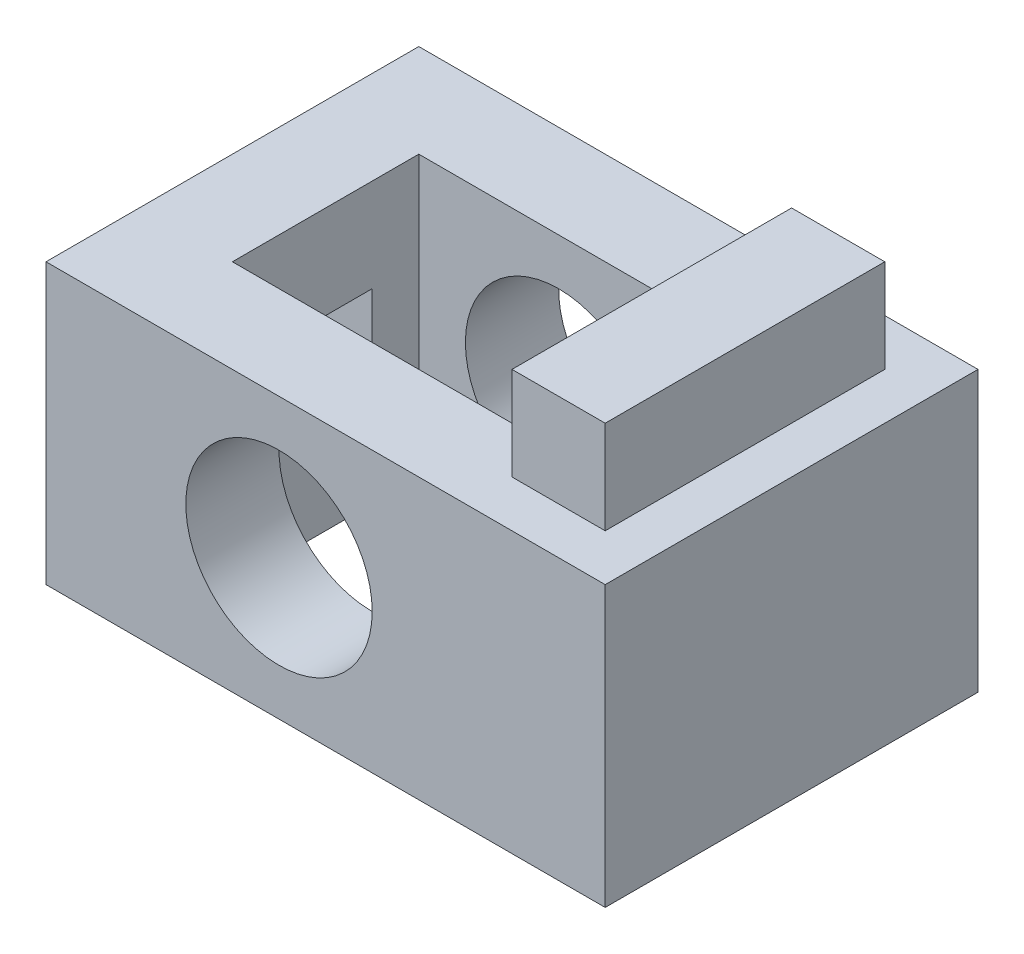
ISO-10303-21;
HEADER;
FILE_DESCRIPTION(('STEP AP214'),'2;1');
FILE_NAME('part.step','',(''),(''),'','','');
FILE_SCHEMA(('AUTOMOTIVE_DESIGN { 1 0 10303 214 1 1 1 1 }'));
ENDSEC;
DATA;
#1=APPLICATION_CONTEXT('core data for automotive mechanical design processes');
#2=APPLICATION_PROTOCOL_DEFINITION('international standard','automotive_design',2000,#1);
#3=PRODUCT_CONTEXT('',#1,'mechanical');
#4=PRODUCT('Part','Part','',(#3));
#5=PRODUCT_RELATED_PRODUCT_CATEGORY('part','',(#4));
#6=PRODUCT_DEFINITION_FORMATION('','',#4);
#7=PRODUCT_DEFINITION_CONTEXT('part definition',#1,'design');
#8=PRODUCT_DEFINITION('design','',#6,#7);
#9=PRODUCT_DEFINITION_SHAPE('','',#8);
#10=(LENGTH_UNIT() NAMED_UNIT(*) SI_UNIT(.MILLI.,.METRE.));
#11=(NAMED_UNIT(*) PLANE_ANGLE_UNIT() SI_UNIT($,.RADIAN.));
#12=(NAMED_UNIT(*) SI_UNIT($,.STERADIAN.) SOLID_ANGLE_UNIT());
#13=UNCERTAINTY_MEASURE_WITH_UNIT(LENGTH_MEASURE(1.E-05),#10,'distance_accuracy_value','');
#14=(GEOMETRIC_REPRESENTATION_CONTEXT(3) GLOBAL_UNCERTAINTY_ASSIGNED_CONTEXT((#13)) GLOBAL_UNIT_ASSIGNED_CONTEXT((#10,
#11,#12)) REPRESENTATION_CONTEXT('',''));
#15=CARTESIAN_POINT('',(0.,0.,0.));
#16=DIRECTION('',(0.,0.,1.));
#17=DIRECTION('',(1.,0.,0.));
#18=AXIS2_PLACEMENT_3D('',#15,#16,#17);
#19=CARTESIAN_POINT('',(-25.4,0.,-127.));
#20=DIRECTION('',(0.,0.,1.));
#21=DIRECTION('',(1.,0.,0.));
#22=AXIS2_PLACEMENT_3D('',#19,#20,#21);
#23=CYLINDRICAL_SURFACE('',#22,50.8);
#24=CARTESIAN_POINT('',(-25.4,0.,-50.8));
#25=DIRECTION('',(0.,0.,-1.));
#26=DIRECTION('',(-1.,0.,0.));
#27=AXIS2_PLACEMENT_3D('',#24,#25,#26);
#28=CIRCLE('',#27,50.8);
#29=CARTESIAN_POINT('',(-76.2,0.,-50.8));
#30=VERTEX_POINT('',#29);
#31=EDGE_CURVE('E192',#30,#30,#28,.F.);
#32=ORIENTED_EDGE('',*,*,#31,.T.);
#33=EDGE_LOOP('',(#32));
#34=FACE_BOUND('',#33,.T.);
#35=CARTESIAN_POINT('',(-25.4,0.,-101.6));
#36=DIRECTION('',(0.,0.,1.));
#37=DIRECTION('',(0.,-1.,0.));
#38=AXIS2_PLACEMENT_3D('',#35,#36,#37);
#39=CIRCLE('',#38,50.8);
#40=CARTESIAN_POINT('',(-25.4,-50.8,-101.6));
#41=VERTEX_POINT('',#40);
#42=EDGE_CURVE('E260',#41,#41,#39,.T.);
#43=ORIENTED_EDGE('',*,*,#42,.F.);
#44=EDGE_LOOP('',(#43));
#45=FACE_BOUND('',#44,.T.);
#46=ADVANCED_FACE('F47',(#34,#45),#23,.F.);
#47=CARTESIAN_POINT('',(152.4,76.2,101.6));
#48=DIRECTION('',(0.,-1.,0.));
#49=DIRECTION('',(0.,0.,-1.));
#50=AXIS2_PLACEMENT_3D('',#47,#48,#49);
#51=PLANE('',#50);
#52=DIRECTION('',(1.,0.,0.));
#53=VECTOR('',#52,1.);
#54=CARTESIAN_POINT('',(-101.6,76.2,50.8));
#55=LINE('',#54,#53);
#56=CARTESIAN_POINT('',(-101.6,76.2,50.8));
#57=VERTEX_POINT('',#56);
#58=CARTESIAN_POINT('',(50.8,76.2,50.8));
#59=VERTEX_POINT('',#58);
#60=EDGE_CURVE('E170',#57,#59,#55,.T.);
#61=ORIENTED_EDGE('',*,*,#60,.F.);
#62=DIRECTION('',(0.,0.,1.));
#63=VECTOR('',#62,1.);
#64=CARTESIAN_POINT('',(-101.6,76.2,-50.8));
#65=LINE('',#64,#63);
#66=CARTESIAN_POINT('',(-101.6,76.2,-50.8));
#67=VERTEX_POINT('',#66);
#68=EDGE_CURVE('E62',#67,#57,#65,.T.);
#69=ORIENTED_EDGE('',*,*,#68,.F.);
#70=DIRECTION('',(-1.,0.,0.));
#71=VECTOR('',#70,1.);
#72=CARTESIAN_POINT('',(-101.6,76.2,-50.8));
#73=LINE('',#72,#71);
#74=CARTESIAN_POINT('',(50.8,76.2,-50.8));
#75=VERTEX_POINT('',#74);
#76=EDGE_CURVE('E177',#75,#67,#73,.T.);
#77=ORIENTED_EDGE('',*,*,#76,.F.);
#78=DIRECTION('',(0.,0.,-1.));
#79=VECTOR('',#78,1.);
#80=CARTESIAN_POINT('',(50.8,76.2,-50.8));
#81=LINE('',#80,#79);
#82=EDGE_CURVE('E163',#59,#75,#81,.T.);
#83=ORIENTED_EDGE('',*,*,#82,.F.);
#84=EDGE_LOOP('',(#61,#69,#77,#83));
#85=FACE_BOUND('',#84,.T.);
#86=DIRECTION('',(0.,0.,1.));
#87=VECTOR('',#86,1.);
#88=CARTESIAN_POINT('',(-152.4,76.2,101.6));
#89=LINE('',#88,#87);
#90=CARTESIAN_POINT('',(-152.4,76.2,-101.6));
#91=VERTEX_POINT('',#90);
#92=CARTESIAN_POINT('',(-152.4,76.2,101.6));
#93=VERTEX_POINT('',#92);
#94=EDGE_CURVE('E265',#91,#93,#89,.T.);
#95=ORIENTED_EDGE('',*,*,#94,.T.);
#96=DIRECTION('',(-1.,0.,0.));
#97=VECTOR('',#96,1.);
#98=CARTESIAN_POINT('',(152.4,76.2,101.6));
#99=LINE('',#98,#97);
#100=CARTESIAN_POINT('',(152.4,76.2,101.6));
#101=VERTEX_POINT('',#100);
#102=EDGE_CURVE('E271',#101,#93,#99,.T.);
#103=ORIENTED_EDGE('',*,*,#102,.F.);
#104=DIRECTION('',(0.,0.,1.));
#105=VECTOR('',#104,1.);
#106=CARTESIAN_POINT('',(152.4,76.2,101.6));
#107=LINE('',#106,#105);
#108=CARTESIAN_POINT('',(152.4,76.2,-101.6));
#109=VERTEX_POINT('',#108);
#110=EDGE_CURVE('E269',#109,#101,#107,.T.);
#111=ORIENTED_EDGE('',*,*,#110,.F.);
#112=DIRECTION('',(-1.,0.,0.));
#113=VECTOR('',#112,1.);
#114=CARTESIAN_POINT('',(152.4,76.2,-101.6));
#115=LINE('',#114,#113);
#116=EDGE_CURVE('E282',#109,#91,#115,.T.);
#117=ORIENTED_EDGE('',*,*,#116,.T.);
#118=EDGE_LOOP('',(#95,#103,#111,#117));
#119=FACE_BOUND('',#118,.T.);
#120=DIRECTION('',(0.,0.,1.));
#121=VECTOR('',#120,1.);
#122=CARTESIAN_POINT('',(76.2,76.2,-76.2));
#123=LINE('',#122,#121);
#124=CARTESIAN_POINT('',(76.2,76.2,-76.2));
#125=VERTEX_POINT('',#124);
#126=CARTESIAN_POINT('',(76.2,76.2,76.2));
#127=VERTEX_POINT('',#126);
#128=EDGE_CURVE('E196',#125,#127,#123,.T.);
#129=ORIENTED_EDGE('',*,*,#128,.F.);
#130=DIRECTION('',(-1.,0.,0.));
#131=VECTOR('',#130,1.);
#132=CARTESIAN_POINT('',(76.2,76.2,-76.2));
#133=LINE('',#132,#131);
#134=CARTESIAN_POINT('',(127.,76.2,-76.2));
#135=VERTEX_POINT('',#134);
#136=EDGE_CURVE('E201',#135,#125,#133,.T.);
#137=ORIENTED_EDGE('',*,*,#136,.F.);
#138=DIRECTION('',(0.,0.,-1.));
#139=VECTOR('',#138,1.);
#140=CARTESIAN_POINT('',(127.,76.2,-76.2));
#141=LINE('',#140,#139);
#142=CARTESIAN_POINT('',(127.,76.2,76.2));
#143=VERTEX_POINT('',#142);
#144=EDGE_CURVE('E213',#143,#135,#141,.T.);
#145=ORIENTED_EDGE('',*,*,#144,.F.);
#146=DIRECTION('',(1.,0.,0.));
#147=VECTOR('',#146,1.);
#148=CARTESIAN_POINT('',(76.2,76.2,76.2));
#149=LINE('',#148,#147);
#150=EDGE_CURVE('E210',#127,#143,#149,.T.);
#151=ORIENTED_EDGE('',*,*,#150,.F.);
#152=EDGE_LOOP('',(#129,#137,#145,#151));
#153=FACE_BOUND('',#152,.T.);
#154=ADVANCED_FACE('F174',(#85,#119,#153),#51,.F.);
#155=CARTESIAN_POINT('',(152.4,76.2,101.6));
#156=DIRECTION('',(0.,0.,-1.));
#157=DIRECTION('',(0.,1.,0.));
#158=AXIS2_PLACEMENT_3D('',#155,#156,#157);
#159=PLANE('',#158);
#160=CARTESIAN_POINT('',(-25.4,0.,101.6));
#161=DIRECTION('',(0.,0.,1.));
#162=DIRECTION('',(1.,0.,0.));
#163=AXIS2_PLACEMENT_3D('',#160,#161,#162);
#164=CIRCLE('',#163,50.8);
#165=CARTESIAN_POINT('',(25.4,0.,101.6));
#166=VERTEX_POINT('',#165);
#167=EDGE_CURVE('E251',#166,#166,#164,.T.);
#168=ORIENTED_EDGE('',*,*,#167,.F.);
#169=EDGE_LOOP('',(#168));
#170=FACE_BOUND('',#169,.T.);
#171=DIRECTION('',(0.,-1.,0.));
#172=VECTOR('',#171,1.);
#173=CARTESIAN_POINT('',(-152.4,76.2,101.6));
#174=LINE('',#173,#172);
#175=CARTESIAN_POINT('',(-152.4,-76.2,101.6));
#176=VERTEX_POINT('',#175);
#177=EDGE_CURVE('E272',#93,#176,#174,.T.);
#178=ORIENTED_EDGE('',*,*,#177,.T.);
#179=DIRECTION('',(-1.,0.,0.));
#180=VECTOR('',#179,1.);
#181=CARTESIAN_POINT('',(152.4,-76.2,101.6));
#182=LINE('',#181,#180);
#183=CARTESIAN_POINT('',(152.4,-76.2,101.6));
#184=VERTEX_POINT('',#183);
#185=EDGE_CURVE('E55',#184,#176,#182,.T.);
#186=ORIENTED_EDGE('',*,*,#185,.F.);
#187=DIRECTION('',(0.,-1.,0.));
#188=VECTOR('',#187,1.);
#189=CARTESIAN_POINT('',(152.4,76.2,101.6));
#190=LINE('',#189,#188);
#191=EDGE_CURVE('E261',#101,#184,#190,.T.);
#192=ORIENTED_EDGE('',*,*,#191,.F.);
#193=ORIENTED_EDGE('',*,*,#102,.T.);
#194=EDGE_LOOP('',(#178,#186,#192,#193));
#195=FACE_BOUND('',#194,.T.);
#196=ADVANCED_FACE('F49',(#170,#195),#159,.F.);
#197=CARTESIAN_POINT('',(152.4,-76.2,101.6));
#198=DIRECTION('',(0.,1.,0.));
#199=DIRECTION('',(0.,0.,1.));
#200=AXIS2_PLACEMENT_3D('',#197,#198,#199);
#201=PLANE('',#200);
#202=DIRECTION('',(-1.,0.,0.));
#203=VECTOR('',#202,1.);
#204=CARTESIAN_POINT('',(152.4,-76.2,-50.8));
#205=LINE('',#204,#203);
#206=CARTESIAN_POINT('',(50.8,-76.2,-50.8));
#207=VERTEX_POINT('',#206);
#208=CARTESIAN_POINT('',(-101.6,-76.2,-50.8));
#209=VERTEX_POINT('',#208);
#210=EDGE_CURVE('E193',#207,#209,#205,.T.);
#211=ORIENTED_EDGE('',*,*,#210,.T.);
#212=DIRECTION('',(0.,0.,1.));
#213=VECTOR('',#212,1.);
#214=CARTESIAN_POINT('',(-101.6,-76.2,101.6));
#215=LINE('',#214,#213);
#216=CARTESIAN_POINT('',(-101.6,-76.2,50.8));
#217=VERTEX_POINT('',#216);
#218=EDGE_CURVE('E184',#209,#217,#215,.T.);
#219=ORIENTED_EDGE('',*,*,#218,.T.);
#220=DIRECTION('',(1.,0.,0.));
#221=VECTOR('',#220,1.);
#222=CARTESIAN_POINT('',(152.4,-76.2,50.8));
#223=LINE('',#222,#221);
#224=CARTESIAN_POINT('',(50.8,-76.2,50.8));
#225=VERTEX_POINT('',#224);
#226=EDGE_CURVE('E190',#217,#225,#223,.T.);
#227=ORIENTED_EDGE('',*,*,#226,.T.);
#228=DIRECTION('',(0.,0.,-1.));
#229=VECTOR('',#228,1.);
#230=CARTESIAN_POINT('',(50.8,-76.2,101.6));
#231=LINE('',#230,#229);
#232=EDGE_CURVE('E13',#225,#207,#231,.T.);
#233=ORIENTED_EDGE('',*,*,#232,.T.);
#234=EDGE_LOOP('',(#211,#219,#227,#233));
#235=FACE_BOUND('',#234,.T.);
#236=DIRECTION('',(0.,0.,-1.));
#237=VECTOR('',#236,1.);
#238=CARTESIAN_POINT('',(-152.4,-76.2,101.6));
#239=LINE('',#238,#237);
#240=CARTESIAN_POINT('',(-152.4,-76.2,-101.6));
#241=VERTEX_POINT('',#240);
#242=EDGE_CURVE('E275',#176,#241,#239,.T.);
#243=ORIENTED_EDGE('',*,*,#242,.T.);
#244=DIRECTION('',(-1.,0.,0.));
#245=VECTOR('',#244,1.);
#246=CARTESIAN_POINT('',(152.4,-76.2,-101.6));
#247=LINE('',#246,#245);
#248=CARTESIAN_POINT('',(152.4,-76.2,-101.6));
#249=VERTEX_POINT('',#248);
#250=EDGE_CURVE('E285',#249,#241,#247,.T.);
#251=ORIENTED_EDGE('',*,*,#250,.F.);
#252=DIRECTION('',(0.,0.,-1.));
#253=VECTOR('',#252,1.);
#254=CARTESIAN_POINT('',(152.4,-76.2,101.6));
#255=LINE('',#254,#253);
#256=EDGE_CURVE('E264',#184,#249,#255,.T.);
#257=ORIENTED_EDGE('',*,*,#256,.F.);
#258=ORIENTED_EDGE('',*,*,#185,.T.);
#259=EDGE_LOOP('',(#243,#251,#257,#258));
#260=FACE_BOUND('',#259,.T.);
#261=ADVANCED_FACE('F304',(#235,#260),#201,.F.);
#262=CARTESIAN_POINT('',(152.4,76.2,-101.6));
#263=DIRECTION('',(0.,0.,1.));
#264=DIRECTION('',(0.,-1.,0.));
#265=AXIS2_PLACEMENT_3D('',#262,#263,#264);
#266=PLANE('',#265);
#267=ORIENTED_EDGE('',*,*,#42,.T.);
#268=EDGE_LOOP('',(#267));
#269=FACE_BOUND('',#268,.T.);
#270=DIRECTION('',(0.,1.,0.));
#271=VECTOR('',#270,1.);
#272=CARTESIAN_POINT('',(-152.4,76.2,-101.6));
#273=LINE('',#272,#271);
#274=EDGE_CURVE('E277',#241,#91,#273,.T.);
#275=ORIENTED_EDGE('',*,*,#274,.T.);
#276=ORIENTED_EDGE('',*,*,#116,.F.);
#277=DIRECTION('',(0.,1.,0.));
#278=VECTOR('',#277,1.);
#279=CARTESIAN_POINT('',(152.4,76.2,-101.6));
#280=LINE('',#279,#278);
#281=EDGE_CURVE('E267',#249,#109,#280,.T.);
#282=ORIENTED_EDGE('',*,*,#281,.F.);
#283=ORIENTED_EDGE('',*,*,#250,.T.);
#284=EDGE_LOOP('',(#275,#276,#282,#283));
#285=FACE_BOUND('',#284,.T.);
#286=ADVANCED_FACE('F358',(#269,#285),#266,.F.);
#287=CARTESIAN_POINT('',(152.4,0.,0.));
#288=DIRECTION('',(1.,0.,0.));
#289=DIRECTION('',(0.,0.,-1.));
#290=AXIS2_PLACEMENT_3D('',#287,#288,#289);
#291=PLANE('',#290);
#292=ORIENTED_EDGE('',*,*,#191,.T.);
#293=ORIENTED_EDGE('',*,*,#256,.T.);
#294=ORIENTED_EDGE('',*,*,#281,.T.);
#295=ORIENTED_EDGE('',*,*,#110,.T.);
#296=EDGE_LOOP('',(#292,#293,#294,#295));
#297=FACE_BOUND('',#296,.T.);
#298=ADVANCED_FACE('F335',(#297),#291,.T.);
#299=CARTESIAN_POINT('',(-152.4,0.,0.));
#300=DIRECTION('',(1.,0.,0.));
#301=DIRECTION('',(0.,0.,-1.));
#302=AXIS2_PLACEMENT_3D('',#299,#300,#301);
#303=PLANE('',#302);
#304=DIRECTION('',(0.,0.,1.));
#305=VECTOR('',#304,1.);
#306=CARTESIAN_POINT('',(-152.4,-25.4,-25.4));
#307=LINE('',#306,#305);
#308=CARTESIAN_POINT('',(-152.4,-25.4,-25.4));
#309=VERTEX_POINT('',#308);
#310=CARTESIAN_POINT('',(-152.4,-25.4,25.4));
#311=VERTEX_POINT('',#310);
#312=EDGE_CURVE('E241',#309,#311,#307,.T.);
#313=ORIENTED_EDGE('',*,*,#312,.F.);
#314=DIRECTION('',(0.,-1.,0.));
#315=VECTOR('',#314,1.);
#316=CARTESIAN_POINT('',(-152.4,25.4,-25.4));
#317=LINE('',#316,#315);
#318=CARTESIAN_POINT('',(-152.4,25.4,-25.4));
#319=VERTEX_POINT('',#318);
#320=EDGE_CURVE('E229',#319,#309,#317,.T.);
#321=ORIENTED_EDGE('',*,*,#320,.F.);
#322=DIRECTION('',(0.,0.,-1.));
#323=VECTOR('',#322,1.);
#324=CARTESIAN_POINT('',(-152.4,25.4,-25.4));
#325=LINE('',#324,#323);
#326=CARTESIAN_POINT('',(-152.4,25.4,25.4));
#327=VERTEX_POINT('',#326);
#328=EDGE_CURVE('E233',#327,#319,#325,.T.);
#329=ORIENTED_EDGE('',*,*,#328,.F.);
#330=DIRECTION('',(0.,1.,0.));
#331=VECTOR('',#330,1.);
#332=CARTESIAN_POINT('',(-152.4,25.4,25.4));
#333=LINE('',#332,#331);
#334=EDGE_CURVE('E244',#311,#327,#333,.T.);
#335=ORIENTED_EDGE('',*,*,#334,.F.);
#336=EDGE_LOOP('',(#313,#321,#329,#335));
#337=FACE_BOUND('',#336,.T.);
#338=ORIENTED_EDGE('',*,*,#177,.F.);
#339=ORIENTED_EDGE('',*,*,#94,.F.);
#340=ORIENTED_EDGE('',*,*,#274,.F.);
#341=ORIENTED_EDGE('',*,*,#242,.F.);
#342=EDGE_LOOP('',(#338,#339,#340,#341));
#343=FACE_BOUND('',#342,.T.);
#344=ADVANCED_FACE('F327',(#337,#343),#303,.F.);
#345=CARTESIAN_POINT('',(-25.4,0.,50.8));
#346=DIRECTION('',(0.,0.,1.));
#347=DIRECTION('',(1.,0.,0.));
#348=AXIS2_PLACEMENT_3D('',#345,#346,#347);
#349=CIRCLE('',#348,50.8);
#350=CARTESIAN_POINT('',(25.4,0.,50.8));
#351=VERTEX_POINT('',#350);
#352=EDGE_CURVE('E189',#351,#351,#349,.F.);
#353=ORIENTED_EDGE('',*,*,#352,.T.);
#354=EDGE_LOOP('',(#353));
#355=FACE_BOUND('',#354,.T.);
#356=ORIENTED_EDGE('',*,*,#167,.T.);
#357=EDGE_LOOP('',(#356));
#358=FACE_BOUND('',#357,.T.);
#359=ADVANCED_FACE('F318',(#355,#358),#23,.F.);
#360=CARTESIAN_POINT('',(-101.6,25.4,-25.4));
#361=DIRECTION('',(0.,0.,-1.));
#362=DIRECTION('',(-1.,0.,0.));
#363=AXIS2_PLACEMENT_3D('',#360,#361,#362);
#364=PLANE('',#363);
#365=ORIENTED_EDGE('',*,*,#320,.T.);
#366=DIRECTION('',(-1.,0.,0.));
#367=VECTOR('',#366,1.);
#368=CARTESIAN_POINT('',(-101.6,-25.4,-25.4));
#369=LINE('',#368,#367);
#370=CARTESIAN_POINT('',(-101.6,-25.4,-25.4));
#371=VERTEX_POINT('',#370);
#372=EDGE_CURVE('E239',#371,#309,#369,.T.);
#373=ORIENTED_EDGE('',*,*,#372,.F.);
#374=DIRECTION('',(0.,-1.,0.));
#375=VECTOR('',#374,1.);
#376=CARTESIAN_POINT('',(-101.6,25.4,-25.4));
#377=LINE('',#376,#375);
#378=CARTESIAN_POINT('',(-101.6,25.4,-25.4));
#379=VERTEX_POINT('',#378);
#380=EDGE_CURVE('E230',#379,#371,#377,.T.);
#381=ORIENTED_EDGE('',*,*,#380,.F.);
#382=DIRECTION('',(-1.,0.,0.));
#383=VECTOR('',#382,1.);
#384=CARTESIAN_POINT('',(-101.6,25.4,-25.4));
#385=LINE('',#384,#383);
#386=EDGE_CURVE('E249',#379,#319,#385,.T.);
#387=ORIENTED_EDGE('',*,*,#386,.T.);
#388=EDGE_LOOP('',(#365,#373,#381,#387));
#389=FACE_BOUND('',#388,.T.);
#390=ADVANCED_FACE('F326',(#389),#364,.F.);
#391=CARTESIAN_POINT('',(-101.6,25.4,-25.4));
#392=DIRECTION('',(0.,1.,0.));
#393=DIRECTION('',(0.,0.,1.));
#394=AXIS2_PLACEMENT_3D('',#391,#392,#393);
#395=PLANE('',#394);
#396=ORIENTED_EDGE('',*,*,#328,.T.);
#397=ORIENTED_EDGE('',*,*,#386,.F.);
#398=DIRECTION('',(0.,0.,-1.));
#399=VECTOR('',#398,1.);
#400=CARTESIAN_POINT('',(-101.6,25.4,-25.4));
#401=LINE('',#400,#399);
#402=CARTESIAN_POINT('',(-101.6,25.4,25.4));
#403=VERTEX_POINT('',#402);
#404=EDGE_CURVE('E237',#403,#379,#401,.T.);
#405=ORIENTED_EDGE('',*,*,#404,.F.);
#406=DIRECTION('',(-1.,0.,0.));
#407=VECTOR('',#406,1.);
#408=CARTESIAN_POINT('',(-101.6,25.4,25.4));
#409=LINE('',#408,#407);
#410=EDGE_CURVE('E252',#403,#327,#409,.T.);
#411=ORIENTED_EDGE('',*,*,#410,.T.);
#412=EDGE_LOOP('',(#396,#397,#405,#411));
#413=FACE_BOUND('',#412,.T.);
#414=ADVANCED_FACE('F333',(#413),#395,.F.);
#415=CARTESIAN_POINT('',(-101.6,25.4,25.4));
#416=DIRECTION('',(0.,0.,1.));
#417=DIRECTION('',(1.,0.,0.));
#418=AXIS2_PLACEMENT_3D('',#415,#416,#417);
#419=PLANE('',#418);
#420=ORIENTED_EDGE('',*,*,#334,.T.);
#421=ORIENTED_EDGE('',*,*,#410,.F.);
#422=DIRECTION('',(0.,1.,0.));
#423=VECTOR('',#422,1.);
#424=CARTESIAN_POINT('',(-101.6,25.4,25.4));
#425=LINE('',#424,#423);
#426=CARTESIAN_POINT('',(-101.6,-25.4,25.4));
#427=VERTEX_POINT('',#426);
#428=EDGE_CURVE('E235',#427,#403,#425,.T.);
#429=ORIENTED_EDGE('',*,*,#428,.F.);
#430=DIRECTION('',(-1.,0.,0.));
#431=VECTOR('',#430,1.);
#432=CARTESIAN_POINT('',(-101.6,-25.4,25.4));
#433=LINE('',#432,#431);
#434=EDGE_CURVE('E254',#427,#311,#433,.T.);
#435=ORIENTED_EDGE('',*,*,#434,.T.);
#436=EDGE_LOOP('',(#420,#421,#429,#435));
#437=FACE_BOUND('',#436,.T.);
#438=ADVANCED_FACE('F474',(#437),#419,.F.);
#439=CARTESIAN_POINT('',(-101.6,-25.4,-25.4));
#440=DIRECTION('',(0.,-1.,0.));
#441=DIRECTION('',(0.,0.,-1.));
#442=AXIS2_PLACEMENT_3D('',#439,#440,#441);
#443=PLANE('',#442);
#444=ORIENTED_EDGE('',*,*,#312,.T.);
#445=ORIENTED_EDGE('',*,*,#434,.F.);
#446=DIRECTION('',(0.,0.,1.));
#447=VECTOR('',#446,1.);
#448=CARTESIAN_POINT('',(-101.6,-25.4,-25.4));
#449=LINE('',#448,#447);
#450=EDGE_CURVE('E232',#371,#427,#449,.T.);
#451=ORIENTED_EDGE('',*,*,#450,.F.);
#452=ORIENTED_EDGE('',*,*,#372,.T.);
#453=EDGE_LOOP('',(#444,#445,#451,#452));
#454=FACE_BOUND('',#453,.T.);
#455=ADVANCED_FACE('F434',(#454),#443,.F.);
#456=CARTESIAN_POINT('',(76.2,127.,-76.2));
#457=DIRECTION('',(1.,0.,0.));
#458=DIRECTION('',(0.,0.,-1.));
#459=AXIS2_PLACEMENT_3D('',#456,#457,#458);
#460=PLANE('',#459);
#461=ORIENTED_EDGE('',*,*,#128,.T.);
#462=DIRECTION('',(0.,-1.,0.));
#463=VECTOR('',#462,1.);
#464=CARTESIAN_POINT('',(76.2,127.,76.2));
#465=LINE('',#464,#463);
#466=CARTESIAN_POINT('',(76.2,127.,76.2));
#467=VERTEX_POINT('',#466);
#468=EDGE_CURVE('E226',#467,#127,#465,.T.);
#469=ORIENTED_EDGE('',*,*,#468,.F.);
#470=DIRECTION('',(0.,0.,1.));
#471=VECTOR('',#470,1.);
#472=CARTESIAN_POINT('',(76.2,127.,-76.2));
#473=LINE('',#472,#471);
#474=CARTESIAN_POINT('',(76.2,127.,-76.2));
#475=VERTEX_POINT('',#474);
#476=EDGE_CURVE('E197',#475,#467,#473,.T.);
#477=ORIENTED_EDGE('',*,*,#476,.F.);
#478=DIRECTION('',(0.,-1.,0.));
#479=VECTOR('',#478,1.);
#480=CARTESIAN_POINT('',(76.2,127.,-76.2));
#481=LINE('',#480,#479);
#482=EDGE_CURVE('E207',#475,#125,#481,.T.);
#483=ORIENTED_EDGE('',*,*,#482,.T.);
#484=EDGE_LOOP('',(#461,#469,#477,#483));
#485=FACE_BOUND('',#484,.T.);
#486=ADVANCED_FACE('F425',(#485),#460,.F.);
#487=CARTESIAN_POINT('',(76.2,127.,76.2));
#488=DIRECTION('',(0.,0.,-1.));
#489=DIRECTION('',(-1.,0.,0.));
#490=AXIS2_PLACEMENT_3D('',#487,#488,#489);
#491=PLANE('',#490);
#492=ORIENTED_EDGE('',*,*,#150,.T.);
#493=DIRECTION('',(0.,-1.,0.));
#494=VECTOR('',#493,1.);
#495=CARTESIAN_POINT('',(127.,127.,76.2));
#496=LINE('',#495,#494);
#497=CARTESIAN_POINT('',(127.,127.,76.2));
#498=VERTEX_POINT('',#497);
#499=EDGE_CURVE('E223',#498,#143,#496,.T.);
#500=ORIENTED_EDGE('',*,*,#499,.F.);
#501=DIRECTION('',(1.,0.,0.));
#502=VECTOR('',#501,1.);
#503=CARTESIAN_POINT('',(76.2,127.,76.2));
#504=LINE('',#503,#502);
#505=EDGE_CURVE('E200',#467,#498,#504,.T.);
#506=ORIENTED_EDGE('',*,*,#505,.F.);
#507=ORIENTED_EDGE('',*,*,#468,.T.);
#508=EDGE_LOOP('',(#492,#500,#506,#507));
#509=FACE_BOUND('',#508,.T.);
#510=ADVANCED_FACE('F415',(#509),#491,.F.);
#511=CARTESIAN_POINT('',(127.,127.,-76.2));
#512=DIRECTION('',(-1.,0.,0.));
#513=DIRECTION('',(0.,0.,1.));
#514=AXIS2_PLACEMENT_3D('',#511,#512,#513);
#515=PLANE('',#514);
#516=ORIENTED_EDGE('',*,*,#144,.T.);
#517=DIRECTION('',(0.,-1.,0.));
#518=VECTOR('',#517,1.);
#519=CARTESIAN_POINT('',(127.,127.,-76.2));
#520=LINE('',#519,#518);
#521=CARTESIAN_POINT('',(127.,127.,-76.2));
#522=VERTEX_POINT('',#521);
#523=EDGE_CURVE('E220',#522,#135,#520,.T.);
#524=ORIENTED_EDGE('',*,*,#523,.F.);
#525=DIRECTION('',(0.,0.,-1.));
#526=VECTOR('',#525,1.);
#527=CARTESIAN_POINT('',(127.,127.,-76.2));
#528=LINE('',#527,#526);
#529=EDGE_CURVE('E203',#498,#522,#528,.T.);
#530=ORIENTED_EDGE('',*,*,#529,.F.);
#531=ORIENTED_EDGE('',*,*,#499,.T.);
#532=EDGE_LOOP('',(#516,#524,#530,#531));
#533=FACE_BOUND('',#532,.T.);
#534=ADVANCED_FACE('F405',(#533),#515,.F.);
#535=CARTESIAN_POINT('',(76.2,127.,-76.2));
#536=DIRECTION('',(0.,0.,1.));
#537=DIRECTION('',(1.,0.,0.));
#538=AXIS2_PLACEMENT_3D('',#535,#536,#537);
#539=PLANE('',#538);
#540=ORIENTED_EDGE('',*,*,#136,.T.);
#541=ORIENTED_EDGE('',*,*,#482,.F.);
#542=DIRECTION('',(-1.,0.,0.));
#543=VECTOR('',#542,1.);
#544=CARTESIAN_POINT('',(76.2,127.,-76.2));
#545=LINE('',#544,#543);
#546=EDGE_CURVE('E205',#522,#475,#545,.T.);
#547=ORIENTED_EDGE('',*,*,#546,.F.);
#548=ORIENTED_EDGE('',*,*,#523,.T.);
#549=EDGE_LOOP('',(#540,#541,#547,#548));
#550=FACE_BOUND('',#549,.T.);
#551=ADVANCED_FACE('F395',(#550),#539,.F.);
#552=CARTESIAN_POINT('',(0.,127.,0.));
#553=DIRECTION('',(0.,1.,0.));
#554=DIRECTION('',(0.,0.,1.));
#555=AXIS2_PLACEMENT_3D('',#552,#553,#554);
#556=PLANE('',#555);
#557=ORIENTED_EDGE('',*,*,#476,.T.);
#558=ORIENTED_EDGE('',*,*,#505,.T.);
#559=ORIENTED_EDGE('',*,*,#529,.T.);
#560=ORIENTED_EDGE('',*,*,#546,.T.);
#561=EDGE_LOOP('',(#557,#558,#559,#560));
#562=FACE_BOUND('',#561,.T.);
#563=ADVANCED_FACE('F391',(#562),#556,.T.);
#564=CARTESIAN_POINT('',(50.8,-152.4,-50.8));
#565=DIRECTION('',(1.,0.,0.));
#566=DIRECTION('',(0.,0.,-1.));
#567=AXIS2_PLACEMENT_3D('',#564,#565,#566);
#568=PLANE('',#567);
#569=DIRECTION('',(0.,1.,0.));
#570=VECTOR('',#569,1.);
#571=CARTESIAN_POINT('',(50.8,-152.4,50.8));
#572=LINE('',#571,#570);
#573=EDGE_CURVE('E70',#225,#59,#572,.T.);
#574=ORIENTED_EDGE('',*,*,#573,.T.);
#575=ORIENTED_EDGE('',*,*,#82,.T.);
#576=DIRECTION('',(0.,1.,0.));
#577=VECTOR('',#576,1.);
#578=CARTESIAN_POINT('',(50.8,-152.4,-50.8));
#579=LINE('',#578,#577);
#580=EDGE_CURVE('E166',#207,#75,#579,.T.);
#581=ORIENTED_EDGE('',*,*,#580,.F.);
#582=ORIENTED_EDGE('',*,*,#232,.F.);
#583=EDGE_LOOP('',(#574,#575,#581,#582));
#584=FACE_BOUND('',#583,.T.);
#585=ADVANCED_FACE('F160',(#584),#568,.F.);
#586=CARTESIAN_POINT('',(-101.6,-152.4,-50.8));
#587=DIRECTION('',(0.,0.,-1.));
#588=DIRECTION('',(-1.,0.,0.));
#589=AXIS2_PLACEMENT_3D('',#586,#587,#588);
#590=PLANE('',#589);
#591=ORIENTED_EDGE('',*,*,#31,.F.);
#592=EDGE_LOOP('',(#591));
#593=FACE_BOUND('',#592,.T.);
#594=ORIENTED_EDGE('',*,*,#580,.T.);
#595=ORIENTED_EDGE('',*,*,#76,.T.);
#596=DIRECTION('',(0.,1.,0.));
#597=VECTOR('',#596,1.);
#598=CARTESIAN_POINT('',(-101.6,-152.4,-50.8));
#599=LINE('',#598,#597);
#600=EDGE_CURVE('E182',#209,#67,#599,.T.);
#601=ORIENTED_EDGE('',*,*,#600,.F.);
#602=ORIENTED_EDGE('',*,*,#210,.F.);
#603=EDGE_LOOP('',(#594,#595,#601,#602));
#604=FACE_BOUND('',#603,.T.);
#605=ADVANCED_FACE('F298',(#593,#604),#590,.F.);
#606=CARTESIAN_POINT('',(-101.6,-152.4,50.8));
#607=DIRECTION('',(0.,0.,1.));
#608=DIRECTION('',(1.,0.,0.));
#609=AXIS2_PLACEMENT_3D('',#606,#607,#608);
#610=PLANE('',#609);
#611=ORIENTED_EDGE('',*,*,#352,.F.);
#612=EDGE_LOOP('',(#611));
#613=FACE_BOUND('',#612,.T.);
#614=DIRECTION('',(0.,1.,0.));
#615=VECTOR('',#614,1.);
#616=CARTESIAN_POINT('',(-101.6,-152.4,50.8));
#617=LINE('',#616,#615);
#618=EDGE_CURVE('E167',#217,#57,#617,.T.);
#619=ORIENTED_EDGE('',*,*,#618,.T.);
#620=ORIENTED_EDGE('',*,*,#60,.T.);
#621=ORIENTED_EDGE('',*,*,#573,.F.);
#622=ORIENTED_EDGE('',*,*,#226,.F.);
#623=EDGE_LOOP('',(#619,#620,#621,#622));
#624=FACE_BOUND('',#623,.T.);
#625=ADVANCED_FACE('F171',(#613,#624),#610,.F.);
#626=CARTESIAN_POINT('',(-101.6,-152.4,-50.8));
#627=DIRECTION('',(-1.,0.,0.));
#628=DIRECTION('',(0.,0.,1.));
#629=AXIS2_PLACEMENT_3D('',#626,#627,#628);
#630=PLANE('',#629);
#631=ORIENTED_EDGE('',*,*,#450,.T.);
#632=ORIENTED_EDGE('',*,*,#428,.T.);
#633=ORIENTED_EDGE('',*,*,#404,.T.);
#634=ORIENTED_EDGE('',*,*,#380,.T.);
#635=EDGE_LOOP('',(#631,#632,#633,#634));
#636=FACE_BOUND('',#635,.T.);
#637=ORIENTED_EDGE('',*,*,#600,.T.);
#638=ORIENTED_EDGE('',*,*,#68,.T.);
#639=ORIENTED_EDGE('',*,*,#618,.F.);
#640=ORIENTED_EDGE('',*,*,#218,.F.);
#641=EDGE_LOOP('',(#637,#638,#639,#640));
#642=FACE_BOUND('',#641,.T.);
#643=ADVANCED_FACE('F306',(#636,#642),#630,.F.);
#644=CLOSED_SHELL('',(#46,#154,#196,#261,#286,#298,#344,#359,#390,#414,#438,#455,#486,#510,#534,
#551,#563,#585,#605,#625,#643));
#645=MANIFOLD_SOLID_BREP('B2',#644);
#646=ADVANCED_BREP_SHAPE_REPRESENTATION('',(#18,#645),#14);
#647=SHAPE_DEFINITION_REPRESENTATION(#9,#646);
ENDSEC;
END-ISO-10303-21;
